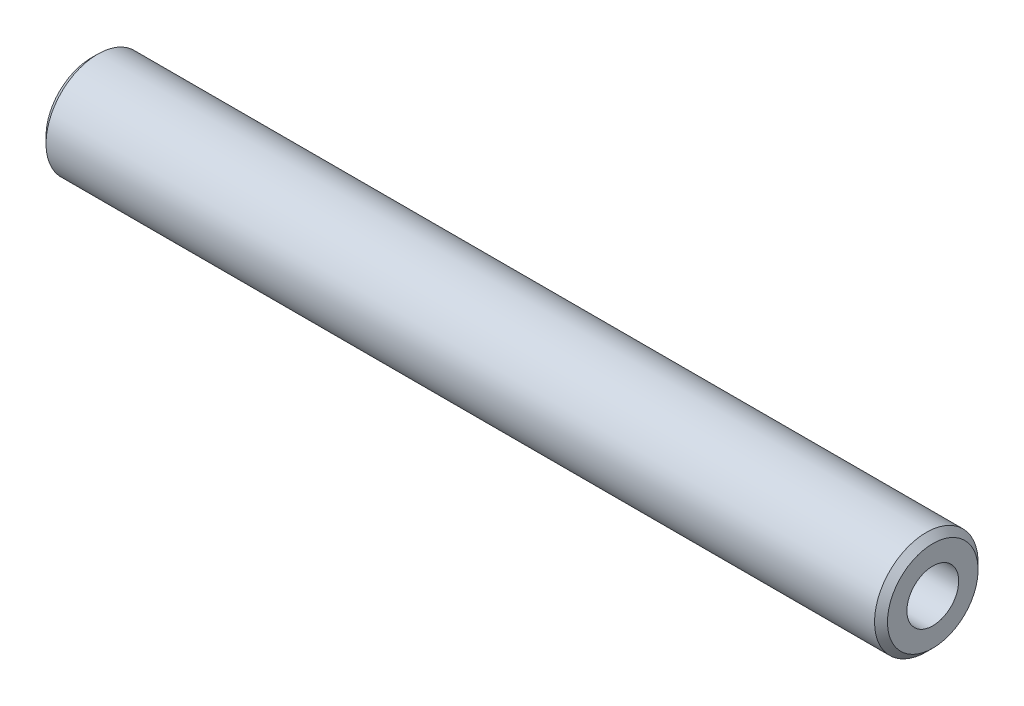
ISO-10303-21;
HEADER;
FILE_DESCRIPTION(('STEP AP214'),'2;1');
FILE_NAME('part.step','',(''),(''),'','','');
FILE_SCHEMA(('AUTOMOTIVE_DESIGN { 1 0 10303 214 1 1 1 1 }'));
ENDSEC;
DATA;
#1=APPLICATION_CONTEXT('core data for automotive mechanical design processes');
#2=APPLICATION_PROTOCOL_DEFINITION('international standard','automotive_design',2000,#1);
#3=PRODUCT_CONTEXT('',#1,'mechanical');
#4=PRODUCT('Part','Part','',(#3));
#5=PRODUCT_RELATED_PRODUCT_CATEGORY('part','',(#4));
#6=PRODUCT_DEFINITION_FORMATION('','',#4);
#7=PRODUCT_DEFINITION_CONTEXT('part definition',#1,'design');
#8=PRODUCT_DEFINITION('design','',#6,#7);
#9=PRODUCT_DEFINITION_SHAPE('','',#8);
#10=(LENGTH_UNIT() NAMED_UNIT(*) SI_UNIT(.MILLI.,.METRE.));
#11=(NAMED_UNIT(*) PLANE_ANGLE_UNIT() SI_UNIT($,.RADIAN.));
#12=(NAMED_UNIT(*) SI_UNIT($,.STERADIAN.) SOLID_ANGLE_UNIT());
#13=UNCERTAINTY_MEASURE_WITH_UNIT(LENGTH_MEASURE(1.E-05),#10,'distance_accuracy_value','');
#14=(GEOMETRIC_REPRESENTATION_CONTEXT(3) GLOBAL_UNCERTAINTY_ASSIGNED_CONTEXT((#13)) GLOBAL_UNIT_ASSIGNED_CONTEXT((#10,
#11,#12)) REPRESENTATION_CONTEXT('',''));
#15=CARTESIAN_POINT('',(0.,0.,0.));
#16=DIRECTION('',(0.,0.,1.));
#17=DIRECTION('',(1.,0.,0.));
#18=AXIS2_PLACEMENT_3D('',#15,#16,#17);
#19=CARTESIAN_POINT('',(-32.5,0.,0.));
#20=DIRECTION('',(1.,0.,0.));
#21=DIRECTION('',(0.,0.,-1.));
#22=AXIS2_PLACEMENT_3D('',#19,#20,#21);
#23=PLANE('',#22);
#24=CARTESIAN_POINT('',(-32.5,0.,0.));
#25=DIRECTION('',(1.,0.,0.));
#26=DIRECTION('',(0.,0.,-1.));
#27=AXIS2_PLACEMENT_3D('',#24,#25,#26);
#28=CIRCLE('',#27,3.5);
#29=CARTESIAN_POINT('',(-32.5,0.,-3.5));
#30=VERTEX_POINT('',#29);
#31=EDGE_CURVE('E79',#30,#30,#28,.F.);
#32=ORIENTED_EDGE('',*,*,#31,.T.);
#33=EDGE_LOOP('',(#32));
#34=FACE_BOUND('',#33,.T.);
#35=CARTESIAN_POINT('',(-32.5,0.,0.));
#36=DIRECTION('',(-1.,0.,0.));
#37=DIRECTION('',(0.,0.,1.));
#38=AXIS2_PLACEMENT_3D('',#35,#36,#37);
#39=CIRCLE('',#38,2.);
#40=CARTESIAN_POINT('',(-32.5,0.,2.));
#41=VERTEX_POINT('',#40);
#42=EDGE_CURVE('E60',#41,#41,#39,.T.);
#43=ORIENTED_EDGE('',*,*,#42,.F.);
#44=EDGE_LOOP('',(#43));
#45=FACE_BOUND('',#44,.T.);
#46=ADVANCED_FACE('F36',(#34,#45),#23,.F.);
#47=CARTESIAN_POINT('',(0.,0.,0.));
#48=DIRECTION('',(-1.,0.,0.));
#49=DIRECTION('',(0.,0.,1.));
#50=AXIS2_PLACEMENT_3D('',#47,#48,#49);
#51=CYLINDRICAL_SURFACE('',#50,4.00000000000001);
#52=CARTESIAN_POINT('',(-32.,0.,0.));
#53=DIRECTION('',(1.,0.,0.));
#54=DIRECTION('',(0.,0.,-1.));
#55=AXIS2_PLACEMENT_3D('',#52,#53,#54);
#56=CIRCLE('',#55,4.00000000000001);
#57=CARTESIAN_POINT('',(-32.,0.,-4.00000000000001));
#58=VERTEX_POINT('',#57);
#59=EDGE_CURVE('E44',#58,#58,#56,.T.);
#60=ORIENTED_EDGE('',*,*,#59,.T.);
#61=EDGE_LOOP('',(#60));
#62=FACE_BOUND('',#61,.T.);
#63=CARTESIAN_POINT('',(32.,0.,0.));
#64=DIRECTION('',(-1.,0.,0.));
#65=DIRECTION('',(0.,0.,1.));
#66=AXIS2_PLACEMENT_3D('',#63,#64,#65);
#67=CIRCLE('',#66,4.00000000000001);
#68=CARTESIAN_POINT('',(32.,0.,4.00000000000001));
#69=VERTEX_POINT('',#68);
#70=EDGE_CURVE('E82',#69,#69,#67,.T.);
#71=ORIENTED_EDGE('',*,*,#70,.T.);
#72=EDGE_LOOP('',(#71));
#73=FACE_BOUND('',#72,.T.);
#74=ADVANCED_FACE('F87',(#62,#73),#51,.T.);
#75=CARTESIAN_POINT('',(32.5,0.,0.));
#76=DIRECTION('',(-1.,0.,0.));
#77=DIRECTION('',(0.,0.,1.));
#78=AXIS2_PLACEMENT_3D('',#75,#76,#77);
#79=PLANE('',#78);
#80=CARTESIAN_POINT('',(32.5,0.,0.));
#81=DIRECTION('',(-1.,0.,0.));
#82=DIRECTION('',(0.,0.,1.));
#83=AXIS2_PLACEMENT_3D('',#80,#81,#82);
#84=CIRCLE('',#83,3.50000000000001);
#85=CARTESIAN_POINT('',(32.5,0.,3.50000000000001));
#86=VERTEX_POINT('',#85);
#87=EDGE_CURVE('E11',#86,#86,#84,.F.);
#88=ORIENTED_EDGE('',*,*,#87,.T.);
#89=EDGE_LOOP('',(#88));
#90=FACE_BOUND('',#89,.T.);
#91=CARTESIAN_POINT('',(32.5,0.,0.));
#92=DIRECTION('',(1.,0.,0.));
#93=DIRECTION('',(0.,0.,-1.));
#94=AXIS2_PLACEMENT_3D('',#91,#92,#93);
#95=CIRCLE('',#94,2.);
#96=CARTESIAN_POINT('',(32.5,0.,-2.));
#97=VERTEX_POINT('',#96);
#98=EDGE_CURVE('E221',#97,#97,#95,.T.);
#99=ORIENTED_EDGE('',*,*,#98,.F.);
#100=EDGE_LOOP('',(#99));
#101=FACE_BOUND('',#100,.T.);
#102=ADVANCED_FACE('F120',(#90,#101),#79,.F.);
#103=CARTESIAN_POINT('',(-21.,0.,0.));
#104=DIRECTION('',(-1.,0.,0.));
#105=DIRECTION('',(0.,0.,1.));
#106=AXIS2_PLACEMENT_3D('',#103,#104,#105);
#107=CONICAL_SURFACE('',#106,1.65,1.02974425867665);
#108=CARTESIAN_POINT('',(-20.0085799786045,0.,0.));
#109=VERTEX_POINT('',#108);
#110=VERTEX_LOOP('',#109);
#111=FACE_BOUND('',#110,.T.);
#112=CARTESIAN_POINT('',(-21.,0.,0.));
#113=DIRECTION('',(-1.,0.,0.));
#114=DIRECTION('',(0.,0.,1.));
#115=AXIS2_PLACEMENT_3D('',#112,#113,#114);
#116=CIRCLE('',#115,1.65);
#117=CARTESIAN_POINT('',(-21.,0.,1.65));
#118=VERTEX_POINT('',#117);
#119=EDGE_CURVE('E76',#118,#118,#116,.T.);
#120=ORIENTED_EDGE('',*,*,#119,.T.);
#121=EDGE_LOOP('',(#120));
#122=FACE_BOUND('',#121,.T.);
#123=ADVANCED_FACE('F116',(#111,#122),#107,.F.);
#124=CARTESIAN_POINT('',(-32.5,0.,0.));
#125=DIRECTION('',(-1.,0.,0.));
#126=DIRECTION('',(0.,0.,1.));
#127=AXIS2_PLACEMENT_3D('',#124,#125,#126);
#128=CYLINDRICAL_SURFACE('',#127,1.65);
#129=ORIENTED_EDGE('',*,*,#119,.F.);
#130=EDGE_LOOP('',(#129));
#131=FACE_BOUND('',#130,.T.);
#132=CARTESIAN_POINT('',(-24.5,0.,0.));
#133=DIRECTION('',(-1.,0.,0.));
#134=DIRECTION('',(0.,0.,1.));
#135=AXIS2_PLACEMENT_3D('',#132,#133,#134);
#136=CIRCLE('',#135,1.65);
#137=CARTESIAN_POINT('',(-24.5,0.,1.65));
#138=VERTEX_POINT('',#137);
#139=EDGE_CURVE('E73',#138,#138,#136,.T.);
#140=ORIENTED_EDGE('',*,*,#139,.T.);
#141=EDGE_LOOP('',(#140));
#142=FACE_BOUND('',#141,.T.);
#143=ADVANCED_FACE('F108',(#131,#142),#128,.F.);
#144=CARTESIAN_POINT('',(-24.5,1.65,0.));
#145=DIRECTION('',(1.,0.,0.));
#146=DIRECTION('',(0.,0.,-1.));
#147=AXIS2_PLACEMENT_3D('',#144,#145,#146);
#148=PLANE('',#147);
#149=ORIENTED_EDGE('',*,*,#139,.F.);
#150=EDGE_LOOP('',(#149));
#151=FACE_BOUND('',#150,.T.);
#152=CARTESIAN_POINT('',(-24.5,0.,0.));
#153=DIRECTION('',(-1.,0.,0.));
#154=DIRECTION('',(0.,0.,1.));
#155=AXIS2_PLACEMENT_3D('',#152,#153,#154);
#156=CIRCLE('',#155,2.);
#157=CARTESIAN_POINT('',(-24.5,0.,2.));
#158=VERTEX_POINT('',#157);
#159=EDGE_CURVE('E64',#158,#158,#156,.T.);
#160=ORIENTED_EDGE('',*,*,#159,.T.);
#161=EDGE_LOOP('',(#160));
#162=FACE_BOUND('',#161,.T.);
#163=ADVANCED_FACE('F102',(#151,#162),#148,.F.);
#164=CARTESIAN_POINT('',(-32.5,0.,0.));
#165=DIRECTION('',(-1.,0.,0.));
#166=DIRECTION('',(0.,0.,1.));
#167=AXIS2_PLACEMENT_3D('',#164,#165,#166);
#168=CYLINDRICAL_SURFACE('',#167,2.);
#169=ORIENTED_EDGE('',*,*,#159,.F.);
#170=EDGE_LOOP('',(#169));
#171=FACE_BOUND('',#170,.T.);
#172=ORIENTED_EDGE('',*,*,#42,.T.);
#173=EDGE_LOOP('',(#172));
#174=FACE_BOUND('',#173,.T.);
#175=ADVANCED_FACE('F54',(#171,#174),#168,.F.);
#176=CARTESIAN_POINT('',(21.,0.,0.));
#177=DIRECTION('',(1.,0.,0.));
#178=DIRECTION('',(0.,0.,-1.));
#179=AXIS2_PLACEMENT_3D('',#176,#177,#178);
#180=CONICAL_SURFACE('',#179,1.65,1.02974425867665);
#181=CARTESIAN_POINT('',(20.0085799786045,0.,0.));
#182=VERTEX_POINT('',#181);
#183=VERTEX_LOOP('',#182);
#184=FACE_BOUND('',#183,.T.);
#185=CARTESIAN_POINT('',(21.,0.,0.));
#186=DIRECTION('',(1.,0.,0.));
#187=DIRECTION('',(0.,0.,-1.));
#188=AXIS2_PLACEMENT_3D('',#185,#186,#187);
#189=CIRCLE('',#188,1.65);
#190=CARTESIAN_POINT('',(21.,0.,-1.65));
#191=VERTEX_POINT('',#190);
#192=EDGE_CURVE('E58',#191,#191,#189,.T.);
#193=ORIENTED_EDGE('',*,*,#192,.T.);
#194=EDGE_LOOP('',(#193));
#195=FACE_BOUND('',#194,.T.);
#196=ADVANCED_FACE('F50',(#184,#195),#180,.F.);
#197=CARTESIAN_POINT('',(32.5,0.,0.));
#198=DIRECTION('',(1.,0.,0.));
#199=DIRECTION('',(0.,0.,-1.));
#200=AXIS2_PLACEMENT_3D('',#197,#198,#199);
#201=CYLINDRICAL_SURFACE('',#200,1.65);
#202=ORIENTED_EDGE('',*,*,#192,.F.);
#203=EDGE_LOOP('',(#202));
#204=FACE_BOUND('',#203,.T.);
#205=CARTESIAN_POINT('',(24.5,0.,0.));
#206=DIRECTION('',(1.,0.,0.));
#207=DIRECTION('',(0.,0.,-1.));
#208=AXIS2_PLACEMENT_3D('',#205,#206,#207);
#209=CIRCLE('',#208,1.65);
#210=CARTESIAN_POINT('',(24.5,0.,-1.65));
#211=VERTEX_POINT('',#210);
#212=EDGE_CURVE('E61',#211,#211,#209,.T.);
#213=ORIENTED_EDGE('',*,*,#212,.T.);
#214=EDGE_LOOP('',(#213));
#215=FACE_BOUND('',#214,.T.);
#216=ADVANCED_FACE('F53',(#204,#215),#201,.F.);
#217=CARTESIAN_POINT('',(24.5,1.65,0.));
#218=DIRECTION('',(-1.,0.,0.));
#219=DIRECTION('',(0.,0.,1.));
#220=AXIS2_PLACEMENT_3D('',#217,#218,#219);
#221=PLANE('',#220);
#222=ORIENTED_EDGE('',*,*,#212,.F.);
#223=EDGE_LOOP('',(#222));
#224=FACE_BOUND('',#223,.T.);
#225=CARTESIAN_POINT('',(24.5,0.,0.));
#226=DIRECTION('',(1.,0.,0.));
#227=DIRECTION('',(0.,0.,-1.));
#228=AXIS2_PLACEMENT_3D('',#225,#226,#227);
#229=CIRCLE('',#228,2.);
#230=CARTESIAN_POINT('',(24.5,0.,-2.));
#231=VERTEX_POINT('',#230);
#232=EDGE_CURVE('E67',#231,#231,#229,.T.);
#233=ORIENTED_EDGE('',*,*,#232,.T.);
#234=EDGE_LOOP('',(#233));
#235=FACE_BOUND('',#234,.T.);
#236=ADVANCED_FACE('F168',(#224,#235),#221,.F.);
#237=CARTESIAN_POINT('',(32.5,0.,0.));
#238=DIRECTION('',(1.,0.,0.));
#239=DIRECTION('',(0.,0.,-1.));
#240=AXIS2_PLACEMENT_3D('',#237,#238,#239);
#241=CYLINDRICAL_SURFACE('',#240,2.);
#242=ORIENTED_EDGE('',*,*,#232,.F.);
#243=EDGE_LOOP('',(#242));
#244=FACE_BOUND('',#243,.T.);
#245=ORIENTED_EDGE('',*,*,#98,.T.);
#246=EDGE_LOOP('',(#245));
#247=FACE_BOUND('',#246,.T.);
#248=ADVANCED_FACE('F93',(#244,#247),#241,.F.);
#249=CARTESIAN_POINT('',(-32.5,0.,0.));
#250=DIRECTION('',(1.,0.,0.));
#251=DIRECTION('',(0.,0.,-1.));
#252=AXIS2_PLACEMENT_3D('',#249,#250,#251);
#253=CONICAL_SURFACE('',#252,3.5,0.785398163397444);
#254=ORIENTED_EDGE('',*,*,#59,.F.);
#255=EDGE_LOOP('',(#254));
#256=FACE_BOUND('',#255,.T.);
#257=ORIENTED_EDGE('',*,*,#31,.F.);
#258=EDGE_LOOP('',(#257));
#259=FACE_BOUND('',#258,.T.);
#260=ADVANCED_FACE('F90',(#256,#259),#253,.T.);
#261=CARTESIAN_POINT('',(32.,0.,0.));
#262=DIRECTION('',(-1.,0.,0.));
#263=DIRECTION('',(0.,0.,1.));
#264=AXIS2_PLACEMENT_3D('',#261,#262,#263);
#265=CONICAL_SURFACE('',#264,4.00000000000001,0.785398163397444);
#266=ORIENTED_EDGE('',*,*,#87,.F.);
#267=EDGE_LOOP('',(#266));
#268=FACE_BOUND('',#267,.T.);
#269=ORIENTED_EDGE('',*,*,#70,.F.);
#270=EDGE_LOOP('',(#269));
#271=FACE_BOUND('',#270,.T.);
#272=ADVANCED_FACE('F38',(#268,#271),#265,.T.);
#273=CLOSED_SHELL('',(#46,#74,#102,#123,#143,#163,#175,#196,#216,#236,#248,#260,#272));
#274=MANIFOLD_SOLID_BREP('B2',#273);
#275=ADVANCED_BREP_SHAPE_REPRESENTATION('',(#18,#274),#14);
#276=SHAPE_DEFINITION_REPRESENTATION(#9,#275);
ENDSEC;
END-ISO-10303-21;
